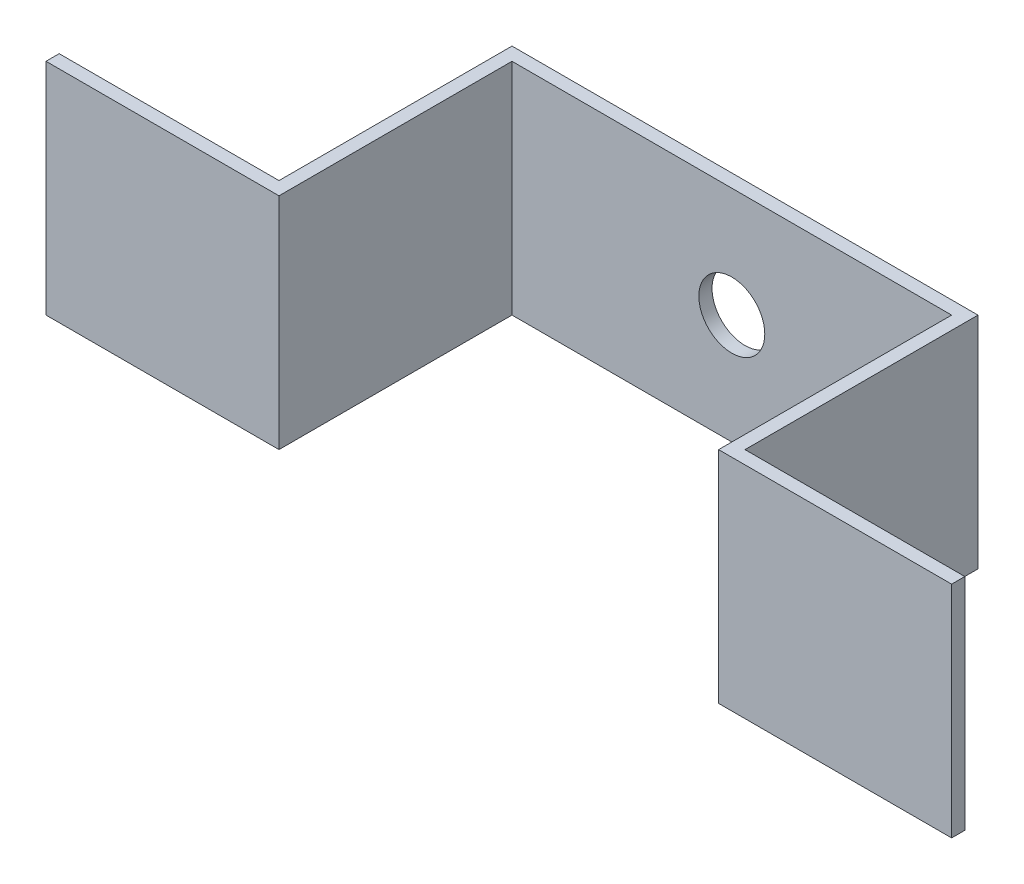
ISO-10303-21;
HEADER;
FILE_DESCRIPTION(('STEP AP214'),'2;1');
FILE_NAME('part.step','',(''),(''),'','','');
FILE_SCHEMA(('AUTOMOTIVE_DESIGN { 1 0 10303 214 1 1 1 1 }'));
ENDSEC;
DATA;
#1=APPLICATION_CONTEXT('core data for automotive mechanical design processes');
#2=APPLICATION_PROTOCOL_DEFINITION('international standard','automotive_design',2000,#1);
#3=PRODUCT_CONTEXT('',#1,'mechanical');
#4=PRODUCT('Part','Part','',(#3));
#5=PRODUCT_RELATED_PRODUCT_CATEGORY('part','',(#4));
#6=PRODUCT_DEFINITION_FORMATION('','',#4);
#7=PRODUCT_DEFINITION_CONTEXT('part definition',#1,'design');
#8=PRODUCT_DEFINITION('design','',#6,#7);
#9=PRODUCT_DEFINITION_SHAPE('','',#8);
#10=(LENGTH_UNIT() NAMED_UNIT(*) SI_UNIT(.MILLI.,.METRE.));
#11=(NAMED_UNIT(*) PLANE_ANGLE_UNIT() SI_UNIT($,.RADIAN.));
#12=(NAMED_UNIT(*) SI_UNIT($,.STERADIAN.) SOLID_ANGLE_UNIT());
#13=UNCERTAINTY_MEASURE_WITH_UNIT(LENGTH_MEASURE(1.E-05),#10,'distance_accuracy_value','');
#14=(GEOMETRIC_REPRESENTATION_CONTEXT(3) GLOBAL_UNCERTAINTY_ASSIGNED_CONTEXT((#13)) GLOBAL_UNIT_ASSIGNED_CONTEXT((#10,
#11,#12)) REPRESENTATION_CONTEXT('',''));
#15=CARTESIAN_POINT('',(0.,0.,0.));
#16=DIRECTION('',(0.,0.,1.));
#17=DIRECTION('',(1.,0.,0.));
#18=AXIS2_PLACEMENT_3D('',#15,#16,#17);
#19=CARTESIAN_POINT('',(-103.,0.,53.));
#20=DIRECTION('',(0.,0.,1.));
#21=DIRECTION('',(1.,0.,0.));
#22=AXIS2_PLACEMENT_3D('',#19,#20,#21);
#23=PLANE('',#22);
#24=DIRECTION('',(0.,1.,0.));
#25=VECTOR('',#24,1.);
#26=CARTESIAN_POINT('',(-53.,0.,53.));
#27=LINE('',#26,#25);
#28=CARTESIAN_POINT('',(-53.,25.,53.));
#29=VERTEX_POINT('',#28);
#30=CARTESIAN_POINT('',(-53.,-25.,53.));
#31=VERTEX_POINT('',#30);
#32=EDGE_CURVE('E184',#29,#31,#27,.F.);
#33=ORIENTED_EDGE('',*,*,#32,.T.);
#34=DIRECTION('',(-1.,0.,0.));
#35=VECTOR('',#34,1.);
#36=CARTESIAN_POINT('',(50.,-25.,53.));
#37=LINE('',#36,#35);
#38=CARTESIAN_POINT('',(-103.,-25.,53.));
#39=VERTEX_POINT('',#38);
#40=EDGE_CURVE('E180',#31,#39,#37,.T.);
#41=ORIENTED_EDGE('',*,*,#40,.T.);
#42=DIRECTION('',(0.,1.,0.));
#43=VECTOR('',#42,1.);
#44=CARTESIAN_POINT('',(-103.,0.,53.));
#45=LINE('',#44,#43);
#46=CARTESIAN_POINT('',(-103.,25.,53.));
#47=VERTEX_POINT('',#46);
#48=EDGE_CURVE('E148',#39,#47,#45,.T.);
#49=ORIENTED_EDGE('',*,*,#48,.T.);
#50=DIRECTION('',(1.,0.,0.));
#51=VECTOR('',#50,1.);
#52=CARTESIAN_POINT('',(50.,25.,53.));
#53=LINE('',#52,#51);
#54=EDGE_CURVE('E188',#47,#29,#53,.T.);
#55=ORIENTED_EDGE('',*,*,#54,.T.);
#56=EDGE_LOOP('',(#33,#41,#49,#55));
#57=FACE_BOUND('',#56,.T.);
#58=ADVANCED_FACE('F17',(#57),#23,.F.);
#59=CARTESIAN_POINT('',(-103.,0.,0.));
#60=DIRECTION('',(1.,0.,0.));
#61=DIRECTION('',(0.,0.,-1.));
#62=AXIS2_PLACEMENT_3D('',#59,#60,#61);
#63=PLANE('',#62);
#64=DIRECTION('',(0.,0.,1.));
#65=VECTOR('',#64,1.);
#66=CARTESIAN_POINT('',(-103.,25.,3.));
#67=LINE('',#66,#65);
#68=CARTESIAN_POINT('',(-103.,25.,56.));
#69=VERTEX_POINT('',#68);
#70=EDGE_CURVE('E190',#69,#47,#67,.F.);
#71=ORIENTED_EDGE('',*,*,#70,.T.);
#72=ORIENTED_EDGE('',*,*,#48,.F.);
#73=DIRECTION('',(0.,0.,1.));
#74=VECTOR('',#73,1.);
#75=CARTESIAN_POINT('',(-103.,-25.,3.));
#76=LINE('',#75,#74);
#77=CARTESIAN_POINT('',(-103.,-25.,56.));
#78=VERTEX_POINT('',#77);
#79=EDGE_CURVE('E177',#39,#78,#76,.T.);
#80=ORIENTED_EDGE('',*,*,#79,.T.);
#81=DIRECTION('',(0.,1.,0.));
#82=VECTOR('',#81,1.);
#83=CARTESIAN_POINT('',(-103.,0.,56.));
#84=LINE('',#83,#82);
#85=EDGE_CURVE('E146',#69,#78,#84,.F.);
#86=ORIENTED_EDGE('',*,*,#85,.F.);
#87=EDGE_LOOP('',(#71,#72,#80,#86));
#88=FACE_BOUND('',#87,.T.);
#89=ADVANCED_FACE('F233',(#88),#63,.F.);
#90=CARTESIAN_POINT('',(-103.,0.,56.));
#91=DIRECTION('',(0.,0.,1.));
#92=DIRECTION('',(1.,0.,0.));
#93=AXIS2_PLACEMENT_3D('',#90,#91,#92);
#94=PLANE('',#93);
#95=ORIENTED_EDGE('',*,*,#85,.T.);
#96=DIRECTION('',(-1.,0.,0.));
#97=VECTOR('',#96,1.);
#98=CARTESIAN_POINT('',(50.,-25.,56.));
#99=LINE('',#98,#97);
#100=CARTESIAN_POINT('',(-50.,-25.,56.));
#101=VERTEX_POINT('',#100);
#102=EDGE_CURVE('E174',#78,#101,#99,.F.);
#103=ORIENTED_EDGE('',*,*,#102,.T.);
#104=DIRECTION('',(0.,1.,0.));
#105=VECTOR('',#104,1.);
#106=CARTESIAN_POINT('',(-50.,0.,56.));
#107=LINE('',#106,#105);
#108=CARTESIAN_POINT('',(-50.,25.,56.));
#109=VERTEX_POINT('',#108);
#110=EDGE_CURVE('E144',#101,#109,#107,.T.);
#111=ORIENTED_EDGE('',*,*,#110,.T.);
#112=DIRECTION('',(1.,0.,0.));
#113=VECTOR('',#112,1.);
#114=CARTESIAN_POINT('',(50.,25.,56.));
#115=LINE('',#114,#113);
#116=EDGE_CURVE('E193',#109,#69,#115,.F.);
#117=ORIENTED_EDGE('',*,*,#116,.T.);
#118=EDGE_LOOP('',(#95,#103,#111,#117));
#119=FACE_BOUND('',#118,.T.);
#120=ADVANCED_FACE('F229',(#119),#94,.T.);
#121=CARTESIAN_POINT('',(-50.,0.,53.));
#122=DIRECTION('',(-1.,0.,0.));
#123=DIRECTION('',(0.,0.,1.));
#124=AXIS2_PLACEMENT_3D('',#121,#122,#123);
#125=PLANE('',#124);
#126=DIRECTION('',(0.,0.,1.));
#127=VECTOR('',#126,1.);
#128=CARTESIAN_POINT('',(-50.,25.,3.));
#129=LINE('',#128,#127);
#130=CARTESIAN_POINT('',(-50.,25.,3.));
#131=VERTEX_POINT('',#130);
#132=EDGE_CURVE('E196',#131,#109,#129,.T.);
#133=ORIENTED_EDGE('',*,*,#132,.T.);
#134=ORIENTED_EDGE('',*,*,#110,.F.);
#135=DIRECTION('',(0.,0.,1.));
#136=VECTOR('',#135,1.);
#137=CARTESIAN_POINT('',(-50.,-25.,3.));
#138=LINE('',#137,#136);
#139=CARTESIAN_POINT('',(-50.,-25.,3.));
#140=VERTEX_POINT('',#139);
#141=EDGE_CURVE('E171',#101,#140,#138,.F.);
#142=ORIENTED_EDGE('',*,*,#141,.T.);
#143=DIRECTION('',(0.,1.,0.));
#144=VECTOR('',#143,1.);
#145=CARTESIAN_POINT('',(-50.,0.,3.));
#146=LINE('',#145,#144);
#147=EDGE_CURVE('E142',#131,#140,#146,.F.);
#148=ORIENTED_EDGE('',*,*,#147,.F.);
#149=EDGE_LOOP('',(#133,#134,#142,#148));
#150=FACE_BOUND('',#149,.T.);
#151=ADVANCED_FACE('F227',(#150),#125,.F.);
#152=CARTESIAN_POINT('',(0.,0.,3.));
#153=DIRECTION('',(0.,0.,1.));
#154=DIRECTION('',(1.,0.,0.));
#155=AXIS2_PLACEMENT_3D('',#152,#153,#154);
#156=PLANE('',#155);
#157=DIRECTION('',(0.,1.,0.));
#158=VECTOR('',#157,1.);
#159=CARTESIAN_POINT('',(50.,0.,3.));
#160=LINE('',#159,#158);
#161=CARTESIAN_POINT('',(50.,-25.,3.));
#162=VERTEX_POINT('',#161);
#163=CARTESIAN_POINT('',(50.,25.,3.));
#164=VERTEX_POINT('',#163);
#165=EDGE_CURVE('E140',#162,#164,#160,.T.);
#166=ORIENTED_EDGE('',*,*,#165,.T.);
#167=DIRECTION('',(1.,0.,0.));
#168=VECTOR('',#167,1.);
#169=CARTESIAN_POINT('',(50.,25.,3.));
#170=LINE('',#169,#168);
#171=EDGE_CURVE('E199',#164,#131,#170,.F.);
#172=ORIENTED_EDGE('',*,*,#171,.T.);
#173=ORIENTED_EDGE('',*,*,#147,.T.);
#174=DIRECTION('',(-1.,0.,0.));
#175=VECTOR('',#174,1.);
#176=CARTESIAN_POINT('',(50.,-25.,3.));
#177=LINE('',#176,#175);
#178=EDGE_CURVE('E168',#140,#162,#177,.F.);
#179=ORIENTED_EDGE('',*,*,#178,.T.);
#180=EDGE_LOOP('',(#166,#172,#173,#179));
#181=FACE_BOUND('',#180,.T.);
#182=CARTESIAN_POINT('',(0.,0.,3.));
#183=DIRECTION('',(0.,0.,1.));
#184=DIRECTION('',(1.,0.,0.));
#185=AXIS2_PLACEMENT_3D('',#182,#183,#184);
#186=CIRCLE('',#185,7.5);
#187=CARTESIAN_POINT('',(7.5,0.,3.));
#188=VERTEX_POINT('',#187);
#189=EDGE_CURVE('E20',#188,#188,#186,.F.);
#190=ORIENTED_EDGE('',*,*,#189,.T.);
#191=EDGE_LOOP('',(#190));
#192=FACE_BOUND('',#191,.T.);
#193=ADVANCED_FACE('F221',(#181,#192),#156,.T.);
#194=CARTESIAN_POINT('',(50.,0.,53.));
#195=DIRECTION('',(1.,0.,0.));
#196=DIRECTION('',(0.,0.,-1.));
#197=AXIS2_PLACEMENT_3D('',#194,#195,#196);
#198=PLANE('',#197);
#199=DIRECTION('',(0.,0.,1.));
#200=VECTOR('',#199,1.);
#201=CARTESIAN_POINT('',(50.,-25.,3.));
#202=LINE('',#201,#200);
#203=CARTESIAN_POINT('',(50.,-25.,56.));
#204=VERTEX_POINT('',#203);
#205=EDGE_CURVE('E165',#162,#204,#202,.T.);
#206=ORIENTED_EDGE('',*,*,#205,.T.);
#207=DIRECTION('',(0.,1.,0.));
#208=VECTOR('',#207,1.);
#209=CARTESIAN_POINT('',(50.,0.,56.));
#210=LINE('',#209,#208);
#211=CARTESIAN_POINT('',(50.,25.,56.));
#212=VERTEX_POINT('',#211);
#213=EDGE_CURVE('E138',#212,#204,#210,.F.);
#214=ORIENTED_EDGE('',*,*,#213,.F.);
#215=DIRECTION('',(0.,0.,1.));
#216=VECTOR('',#215,1.);
#217=CARTESIAN_POINT('',(50.,25.,3.));
#218=LINE('',#217,#216);
#219=EDGE_CURVE('E202',#212,#164,#218,.F.);
#220=ORIENTED_EDGE('',*,*,#219,.T.);
#221=ORIENTED_EDGE('',*,*,#165,.F.);
#222=EDGE_LOOP('',(#206,#214,#220,#221));
#223=FACE_BOUND('',#222,.T.);
#224=ADVANCED_FACE('F216',(#223),#198,.F.);
#225=CARTESIAN_POINT('',(103.,0.,56.));
#226=DIRECTION('',(0.,0.,1.));
#227=DIRECTION('',(1.,0.,0.));
#228=AXIS2_PLACEMENT_3D('',#225,#226,#227);
#229=PLANE('',#228);
#230=DIRECTION('',(0.,1.,0.));
#231=VECTOR('',#230,1.);
#232=CARTESIAN_POINT('',(103.,0.,56.));
#233=LINE('',#232,#231);
#234=CARTESIAN_POINT('',(103.,-25.,56.));
#235=VERTEX_POINT('',#234);
#236=CARTESIAN_POINT('',(103.,25.,56.));
#237=VERTEX_POINT('',#236);
#238=EDGE_CURVE('E136',#235,#237,#233,.T.);
#239=ORIENTED_EDGE('',*,*,#238,.T.);
#240=DIRECTION('',(1.,0.,0.));
#241=VECTOR('',#240,1.);
#242=CARTESIAN_POINT('',(50.,25.,56.));
#243=LINE('',#242,#241);
#244=EDGE_CURVE('E205',#237,#212,#243,.F.);
#245=ORIENTED_EDGE('',*,*,#244,.T.);
#246=ORIENTED_EDGE('',*,*,#213,.T.);
#247=DIRECTION('',(-1.,0.,0.));
#248=VECTOR('',#247,1.);
#249=CARTESIAN_POINT('',(50.,-25.,56.));
#250=LINE('',#249,#248);
#251=EDGE_CURVE('E162',#204,#235,#250,.F.);
#252=ORIENTED_EDGE('',*,*,#251,.T.);
#253=EDGE_LOOP('',(#239,#245,#246,#252));
#254=FACE_BOUND('',#253,.T.);
#255=ADVANCED_FACE('F213',(#254),#229,.T.);
#256=CARTESIAN_POINT('',(103.,0.,0.));
#257=DIRECTION('',(-1.,0.,0.));
#258=DIRECTION('',(0.,0.,1.));
#259=AXIS2_PLACEMENT_3D('',#256,#257,#258);
#260=PLANE('',#259);
#261=DIRECTION('',(0.,0.,1.));
#262=VECTOR('',#261,1.);
#263=CARTESIAN_POINT('',(103.,-25.,3.));
#264=LINE('',#263,#262);
#265=CARTESIAN_POINT('',(103.,-25.,53.));
#266=VERTEX_POINT('',#265);
#267=EDGE_CURVE('E157',#235,#266,#264,.F.);
#268=ORIENTED_EDGE('',*,*,#267,.T.);
#269=DIRECTION('',(0.,1.,0.));
#270=VECTOR('',#269,1.);
#271=CARTESIAN_POINT('',(103.,0.,53.));
#272=LINE('',#271,#270);
#273=CARTESIAN_POINT('',(103.,25.,53.));
#274=VERTEX_POINT('',#273);
#275=EDGE_CURVE('E103',#266,#274,#272,.T.);
#276=ORIENTED_EDGE('',*,*,#275,.T.);
#277=DIRECTION('',(0.,0.,1.));
#278=VECTOR('',#277,1.);
#279=CARTESIAN_POINT('',(103.,25.,3.));
#280=LINE('',#279,#278);
#281=EDGE_CURVE('E127',#274,#237,#280,.T.);
#282=ORIENTED_EDGE('',*,*,#281,.T.);
#283=ORIENTED_EDGE('',*,*,#238,.F.);
#284=EDGE_LOOP('',(#268,#276,#282,#283));
#285=FACE_BOUND('',#284,.T.);
#286=ADVANCED_FACE('F207',(#285),#260,.F.);
#287=CARTESIAN_POINT('',(103.,0.,53.));
#288=DIRECTION('',(0.,0.,1.));
#289=DIRECTION('',(1.,0.,0.));
#290=AXIS2_PLACEMENT_3D('',#287,#288,#289);
#291=PLANE('',#290);
#292=DIRECTION('',(1.,0.,0.));
#293=VECTOR('',#292,1.);
#294=CARTESIAN_POINT('',(50.,25.,53.));
#295=LINE('',#294,#293);
#296=CARTESIAN_POINT('',(53.,25.,53.));
#297=VERTEX_POINT('',#296);
#298=EDGE_CURVE('E112',#297,#274,#295,.T.);
#299=ORIENTED_EDGE('',*,*,#298,.T.);
#300=ORIENTED_EDGE('',*,*,#275,.F.);
#301=DIRECTION('',(-1.,0.,0.));
#302=VECTOR('',#301,1.);
#303=CARTESIAN_POINT('',(50.,-25.,53.));
#304=LINE('',#303,#302);
#305=CARTESIAN_POINT('',(53.,-25.,53.));
#306=VERTEX_POINT('',#305);
#307=EDGE_CURVE('E114',#266,#306,#304,.T.);
#308=ORIENTED_EDGE('',*,*,#307,.T.);
#309=DIRECTION('',(0.,1.,0.));
#310=VECTOR('',#309,1.);
#311=CARTESIAN_POINT('',(53.,0.,53.));
#312=LINE('',#311,#310);
#313=EDGE_CURVE('E109',#297,#306,#312,.F.);
#314=ORIENTED_EDGE('',*,*,#313,.F.);
#315=EDGE_LOOP('',(#299,#300,#308,#314));
#316=FACE_BOUND('',#315,.T.);
#317=ADVANCED_FACE('F111',(#316),#291,.F.);
#318=CARTESIAN_POINT('',(0.,0.,-7.));
#319=DIRECTION('',(0.,0.,1.));
#320=DIRECTION('',(1.,0.,0.));
#321=AXIS2_PLACEMENT_3D('',#318,#319,#320);
#322=CYLINDRICAL_SURFACE('',#321,7.5);
#323=CARTESIAN_POINT('',(0.,0.,0.));
#324=DIRECTION('',(0.,0.,1.));
#325=DIRECTION('',(1.,0.,0.));
#326=AXIS2_PLACEMENT_3D('',#323,#324,#325);
#327=CIRCLE('',#326,7.5);
#328=CARTESIAN_POINT('',(7.5,0.,0.));
#329=VERTEX_POINT('',#328);
#330=EDGE_CURVE('E149',#329,#329,#327,.F.);
#331=ORIENTED_EDGE('',*,*,#330,.T.);
#332=EDGE_LOOP('',(#331));
#333=FACE_BOUND('',#332,.T.);
#334=ORIENTED_EDGE('',*,*,#189,.F.);
#335=EDGE_LOOP('',(#334));
#336=FACE_BOUND('',#335,.T.);
#337=ADVANCED_FACE('F259',(#333,#336),#322,.F.);
#338=CARTESIAN_POINT('',(53.,0.,53.));
#339=DIRECTION('',(1.,0.,0.));
#340=DIRECTION('',(0.,1.,0.));
#341=AXIS2_PLACEMENT_3D('',#338,#339,#340);
#342=PLANE('',#341);
#343=ORIENTED_EDGE('',*,*,#313,.T.);
#344=DIRECTION('',(0.,0.,1.));
#345=VECTOR('',#344,1.);
#346=CARTESIAN_POINT('',(53.,-25.,3.));
#347=LINE('',#346,#345);
#348=CARTESIAN_POINT('',(53.,-25.,0.));
#349=VERTEX_POINT('',#348);
#350=EDGE_CURVE('E151',#306,#349,#347,.F.);
#351=ORIENTED_EDGE('',*,*,#350,.T.);
#352=DIRECTION('',(0.,1.,0.));
#353=VECTOR('',#352,1.);
#354=CARTESIAN_POINT('',(53.,0.,0.));
#355=LINE('',#354,#353);
#356=CARTESIAN_POINT('',(53.,25.,0.));
#357=VERTEX_POINT('',#356);
#358=EDGE_CURVE('E131',#349,#357,#355,.T.);
#359=ORIENTED_EDGE('',*,*,#358,.T.);
#360=DIRECTION('',(0.,0.,1.));
#361=VECTOR('',#360,1.);
#362=CARTESIAN_POINT('',(53.,25.,3.));
#363=LINE('',#362,#361);
#364=EDGE_CURVE('E119',#357,#297,#363,.T.);
#365=ORIENTED_EDGE('',*,*,#364,.T.);
#366=EDGE_LOOP('',(#343,#351,#359,#365));
#367=FACE_BOUND('',#366,.T.);
#368=ADVANCED_FACE('F130',(#367),#342,.T.);
#369=CARTESIAN_POINT('',(50.,25.,3.));
#370=DIRECTION('',(0.,-1.,0.));
#371=DIRECTION('',(1.,0.,0.));
#372=AXIS2_PLACEMENT_3D('',#369,#370,#371);
#373=PLANE('',#372);
#374=DIRECTION('',(0.,0.,-1.));
#375=VECTOR('',#374,1.);
#376=CARTESIAN_POINT('',(-53.,25.,53.));
#377=LINE('',#376,#375);
#378=CARTESIAN_POINT('',(-53.,25.,0.));
#379=VERTEX_POINT('',#378);
#380=EDGE_CURVE('E186',#379,#29,#377,.F.);
#381=ORIENTED_EDGE('',*,*,#380,.T.);
#382=ORIENTED_EDGE('',*,*,#54,.F.);
#383=ORIENTED_EDGE('',*,*,#70,.F.);
#384=ORIENTED_EDGE('',*,*,#116,.F.);
#385=ORIENTED_EDGE('',*,*,#132,.F.);
#386=ORIENTED_EDGE('',*,*,#171,.F.);
#387=ORIENTED_EDGE('',*,*,#219,.F.);
#388=ORIENTED_EDGE('',*,*,#244,.F.);
#389=ORIENTED_EDGE('',*,*,#281,.F.);
#390=ORIENTED_EDGE('',*,*,#298,.F.);
#391=ORIENTED_EDGE('',*,*,#364,.F.);
#392=DIRECTION('',(1.,0.,0.));
#393=VECTOR('',#392,1.);
#394=CARTESIAN_POINT('',(0.,25.,0.));
#395=LINE('',#394,#393);
#396=EDGE_CURVE('E154',#357,#379,#395,.F.);
#397=ORIENTED_EDGE('',*,*,#396,.T.);
#398=EDGE_LOOP('',(#381,#382,#383,#384,#385,#386,#387,#388,#389,#390,#391,#397));
#399=FACE_BOUND('',#398,.T.);
#400=ADVANCED_FACE('F123',(#399),#373,.F.);
#401=CARTESIAN_POINT('',(-53.,0.,53.));
#402=DIRECTION('',(1.,0.,0.));
#403=DIRECTION('',(0.,0.,-1.));
#404=AXIS2_PLACEMENT_3D('',#401,#402,#403);
#405=PLANE('',#404);
#406=DIRECTION('',(0.,0.,1.));
#407=VECTOR('',#406,1.);
#408=CARTESIAN_POINT('',(-53.,-25.,3.));
#409=LINE('',#408,#407);
#410=CARTESIAN_POINT('',(-53.,-25.,0.));
#411=VERTEX_POINT('',#410);
#412=EDGE_CURVE('E34',#411,#31,#409,.T.);
#413=ORIENTED_EDGE('',*,*,#412,.T.);
#414=ORIENTED_EDGE('',*,*,#32,.F.);
#415=ORIENTED_EDGE('',*,*,#380,.F.);
#416=DIRECTION('',(0.,1.,0.));
#417=VECTOR('',#416,1.);
#418=CARTESIAN_POINT('',(-53.,0.,0.));
#419=LINE('',#418,#417);
#420=EDGE_CURVE('E26',#379,#411,#419,.F.);
#421=ORIENTED_EDGE('',*,*,#420,.T.);
#422=EDGE_LOOP('',(#413,#414,#415,#421));
#423=FACE_BOUND('',#422,.T.);
#424=ADVANCED_FACE('F238',(#423),#405,.F.);
#425=CARTESIAN_POINT('',(50.,-25.,3.));
#426=DIRECTION('',(0.,1.,0.));
#427=DIRECTION('',(-1.,0.,0.));
#428=AXIS2_PLACEMENT_3D('',#425,#426,#427);
#429=PLANE('',#428);
#430=ORIENTED_EDGE('',*,*,#350,.F.);
#431=ORIENTED_EDGE('',*,*,#307,.F.);
#432=ORIENTED_EDGE('',*,*,#267,.F.);
#433=ORIENTED_EDGE('',*,*,#251,.F.);
#434=ORIENTED_EDGE('',*,*,#205,.F.);
#435=ORIENTED_EDGE('',*,*,#178,.F.);
#436=ORIENTED_EDGE('',*,*,#141,.F.);
#437=ORIENTED_EDGE('',*,*,#102,.F.);
#438=ORIENTED_EDGE('',*,*,#79,.F.);
#439=ORIENTED_EDGE('',*,*,#40,.F.);
#440=ORIENTED_EDGE('',*,*,#412,.F.);
#441=DIRECTION('',(1.,0.,0.));
#442=VECTOR('',#441,1.);
#443=CARTESIAN_POINT('',(0.,-25.,0.));
#444=LINE('',#443,#442);
#445=EDGE_CURVE('E11',#411,#349,#444,.T.);
#446=ORIENTED_EDGE('',*,*,#445,.T.);
#447=EDGE_LOOP('',(#430,#431,#432,#433,#434,#435,#436,#437,#438,#439,#440,#446));
#448=FACE_BOUND('',#447,.T.);
#449=ADVANCED_FACE('F211',(#448),#429,.F.);
#450=CARTESIAN_POINT('',(0.,0.,0.));
#451=DIRECTION('',(0.,0.,1.));
#452=DIRECTION('',(1.,0.,0.));
#453=AXIS2_PLACEMENT_3D('',#450,#451,#452);
#454=PLANE('',#453);
#455=ORIENTED_EDGE('',*,*,#420,.F.);
#456=ORIENTED_EDGE('',*,*,#396,.F.);
#457=ORIENTED_EDGE('',*,*,#358,.F.);
#458=ORIENTED_EDGE('',*,*,#445,.F.);
#459=EDGE_LOOP('',(#455,#456,#457,#458));
#460=FACE_BOUND('',#459,.T.);
#461=ORIENTED_EDGE('',*,*,#330,.F.);
#462=EDGE_LOOP('',(#461));
#463=FACE_BOUND('',#462,.T.);
#464=ADVANCED_FACE('F243',(#460,#463),#454,.F.);
#465=CLOSED_SHELL('',(#58,#89,#120,#151,#193,#224,#255,#286,#317,#337,#368,#400,#424,#449,#464));
#466=MANIFOLD_SOLID_BREP('B1',#465);
#467=ADVANCED_BREP_SHAPE_REPRESENTATION('',(#18,#466),#14);
#468=SHAPE_DEFINITION_REPRESENTATION(#9,#467);
ENDSEC;
END-ISO-10303-21;
